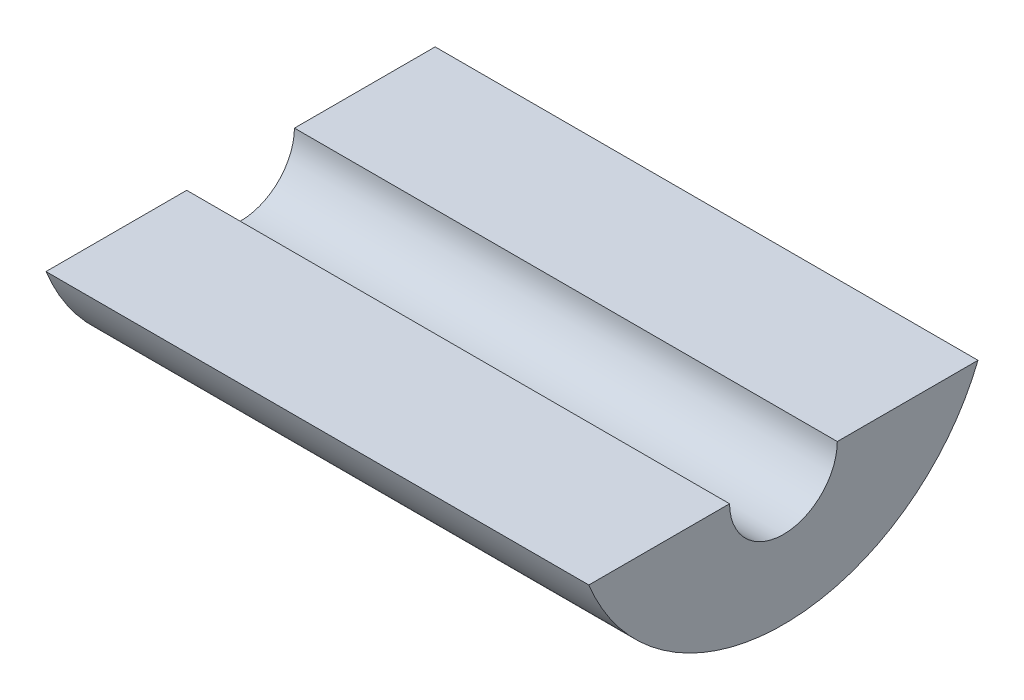
ISO-10303-21;
HEADER;
FILE_DESCRIPTION(('STEP AP214'),'2;1');
FILE_NAME('part.step','',(''),(''),'','','');
FILE_SCHEMA(('AUTOMOTIVE_DESIGN { 1 0 10303 214 1 1 1 1 }'));
ENDSEC;
DATA;
#1=APPLICATION_CONTEXT('core data for automotive mechanical design processes');
#2=APPLICATION_PROTOCOL_DEFINITION('international standard','automotive_design',2000,#1);
#3=PRODUCT_CONTEXT('',#1,'mechanical');
#4=PRODUCT('Part','Part','',(#3));
#5=PRODUCT_RELATED_PRODUCT_CATEGORY('part','',(#4));
#6=PRODUCT_DEFINITION_FORMATION('','',#4);
#7=PRODUCT_DEFINITION_CONTEXT('part definition',#1,'design');
#8=PRODUCT_DEFINITION('design','',#6,#7);
#9=PRODUCT_DEFINITION_SHAPE('','',#8);
#10=(LENGTH_UNIT() NAMED_UNIT(*) SI_UNIT(.MILLI.,.METRE.));
#11=(NAMED_UNIT(*) PLANE_ANGLE_UNIT() SI_UNIT($,.RADIAN.));
#12=(NAMED_UNIT(*) SI_UNIT($,.STERADIAN.) SOLID_ANGLE_UNIT());
#13=UNCERTAINTY_MEASURE_WITH_UNIT(LENGTH_MEASURE(1.E-05),#10,'distance_accuracy_value','');
#14=(GEOMETRIC_REPRESENTATION_CONTEXT(3) GLOBAL_UNCERTAINTY_ASSIGNED_CONTEXT((#13)) GLOBAL_UNIT_ASSIGNED_CONTEXT((#10,
#11,#12)) REPRESENTATION_CONTEXT('',''));
#15=CARTESIAN_POINT('',(0.,0.,0.));
#16=DIRECTION('',(0.,0.,1.));
#17=DIRECTION('',(1.,0.,0.));
#18=AXIS2_PLACEMENT_3D('',#15,#16,#17);
#19=CARTESIAN_POINT('',(0.,5.5,0.));
#20=DIRECTION('',(0.,1.,0.));
#21=DIRECTION('',(0.,0.,1.));
#22=AXIS2_PLACEMENT_3D('',#19,#20,#21);
#23=PLANE('',#22);
#24=DIRECTION('',(-1.,0.,0.));
#25=VECTOR('',#24,1.);
#26=CARTESIAN_POINT('',(80.01,5.5,6.51005000055557));
#27=LINE('',#26,#25);
#28=CARTESIAN_POINT('',(28.67,5.5,6.51005000055557));
#29=VERTEX_POINT('',#28);
#30=CARTESIAN_POINT('',(51.34,5.5,6.51005000055557));
#31=VERTEX_POINT('',#30);
#32=EDGE_CURVE('E94',#29,#31,#27,.F.);
#33=ORIENTED_EDGE('',*,*,#32,.T.);
#34=DIRECTION('',(0.,0.,-1.));
#35=VECTOR('',#34,1.);
#36=CARTESIAN_POINT('',(51.34,5.5,17.52));
#37=LINE('',#36,#35);
#38=CARTESIAN_POINT('',(51.34,5.5,0.634581549236986));
#39=VERTEX_POINT('',#38);
#40=EDGE_CURVE('E102',#31,#39,#37,.T.);
#41=ORIENTED_EDGE('',*,*,#40,.T.);
#42=DIRECTION('',(-1.,0.,0.));
#43=VECTOR('',#42,1.);
#44=CARTESIAN_POINT('',(80.01,5.5,0.634581549236986));
#45=LINE('',#44,#43);
#46=CARTESIAN_POINT('',(28.67,5.5,0.634581549236986));
#47=VERTEX_POINT('',#46);
#48=EDGE_CURVE('E98',#47,#39,#45,.F.);
#49=ORIENTED_EDGE('',*,*,#48,.F.);
#50=DIRECTION('',(0.,0.,1.));
#51=VECTOR('',#50,1.);
#52=CARTESIAN_POINT('',(28.67,5.5,17.52));
#53=LINE('',#52,#51);
#54=EDGE_CURVE('E87',#47,#29,#53,.T.);
#55=ORIENTED_EDGE('',*,*,#54,.T.);
#56=EDGE_LOOP('',(#33,#41,#49,#55));
#57=FACE_BOUND('',#56,.T.);
#58=ADVANCED_FACE('F42',(#57),#23,.T.);
#59=DIRECTION('',(-1.,0.,0.));
#60=VECTOR('',#59,1.);
#61=CARTESIAN_POINT('',(80.01,5.5,16.885418450763));
#62=LINE('',#61,#60);
#63=CARTESIAN_POINT('',(51.34,5.5,16.885418450763));
#64=VERTEX_POINT('',#63);
#65=CARTESIAN_POINT('',(28.67,5.5,16.885418450763));
#66=VERTEX_POINT('',#65);
#67=EDGE_CURVE('E46',#64,#66,#62,.T.);
#68=ORIENTED_EDGE('',*,*,#67,.F.);
#69=CARTESIAN_POINT('',(51.34,5.5,11.0099499994444));
#70=VERTEX_POINT('',#69);
#71=EDGE_CURVE('E104',#64,#70,#37,.T.);
#72=ORIENTED_EDGE('',*,*,#71,.T.);
#73=DIRECTION('',(-1.,0.,0.));
#74=VECTOR('',#73,1.);
#75=CARTESIAN_POINT('',(80.01,5.5,11.0099499994444));
#76=LINE('',#75,#74);
#77=CARTESIAN_POINT('',(28.67,5.5,11.0099499994444));
#78=VERTEX_POINT('',#77);
#79=EDGE_CURVE('E99',#70,#78,#76,.T.);
#80=ORIENTED_EDGE('',*,*,#79,.T.);
#81=EDGE_CURVE('E89',#78,#66,#53,.T.);
#82=ORIENTED_EDGE('',*,*,#81,.T.);
#83=EDGE_LOOP('',(#68,#72,#80,#82));
#84=FACE_BOUND('',#83,.T.);
#85=ADVANCED_FACE('F113',(#84),#23,.T.);
#86=CARTESIAN_POINT('',(80.01,8.76,8.76));
#87=DIRECTION('',(-1.,0.,0.));
#88=DIRECTION('',(0.,0.,1.));
#89=AXIS2_PLACEMENT_3D('',#86,#87,#88);
#90=CYLINDRICAL_SURFACE('',#89,8.755);
#91=CARTESIAN_POINT('',(28.67,8.76,8.76));
#92=DIRECTION('',(1.,0.,0.));
#93=DIRECTION('',(0.,0.,-1.));
#94=AXIS2_PLACEMENT_3D('',#91,#92,#93);
#95=CIRCLE('',#94,8.755);
#96=EDGE_CURVE('E107',#66,#47,#95,.T.);
#97=ORIENTED_EDGE('',*,*,#96,.T.);
#98=ORIENTED_EDGE('',*,*,#48,.T.);
#99=CARTESIAN_POINT('',(51.34,8.76,8.76));
#100=DIRECTION('',(-1.,0.,0.));
#101=DIRECTION('',(0.,0.,1.));
#102=AXIS2_PLACEMENT_3D('',#99,#100,#101);
#103=CIRCLE('',#102,8.755);
#104=EDGE_CURVE('E59',#39,#64,#103,.T.);
#105=ORIENTED_EDGE('',*,*,#104,.T.);
#106=ORIENTED_EDGE('',*,*,#67,.T.);
#107=EDGE_LOOP('',(#97,#98,#105,#106));
#108=FACE_BOUND('',#107,.T.);
#109=ADVANCED_FACE('F115',(#108),#90,.T.);
#110=CARTESIAN_POINT('',(80.01,5.515,8.76));
#111=DIRECTION('',(-1.,0.,0.));
#112=DIRECTION('',(0.,0.,1.));
#113=AXIS2_PLACEMENT_3D('',#110,#111,#112);
#114=CYLINDRICAL_SURFACE('',#113,2.25);
#115=ORIENTED_EDGE('',*,*,#32,.F.);
#116=CARTESIAN_POINT('',(28.67,5.515,8.76));
#117=DIRECTION('',(-1.,0.,0.));
#118=DIRECTION('',(0.,0.,1.));
#119=AXIS2_PLACEMENT_3D('',#116,#117,#118);
#120=CIRCLE('',#119,2.25);
#121=EDGE_CURVE('E11',#29,#78,#120,.T.);
#122=ORIENTED_EDGE('',*,*,#121,.T.);
#123=ORIENTED_EDGE('',*,*,#79,.F.);
#124=CARTESIAN_POINT('',(51.34,5.515,8.76));
#125=DIRECTION('',(-1.,0.,0.));
#126=DIRECTION('',(0.,0.,1.));
#127=AXIS2_PLACEMENT_3D('',#124,#125,#126);
#128=CIRCLE('',#127,2.25);
#129=EDGE_CURVE('E51',#31,#70,#128,.T.);
#130=ORIENTED_EDGE('',*,*,#129,.F.);
#131=EDGE_LOOP('',(#115,#122,#123,#130));
#132=FACE_BOUND('',#131,.T.);
#133=ADVANCED_FACE('F95',(#132),#114,.F.);
#134=CARTESIAN_POINT('',(51.34,0.,17.52));
#135=DIRECTION('',(-1.,0.,0.));
#136=DIRECTION('',(0.,0.,1.));
#137=AXIS2_PLACEMENT_3D('',#134,#135,#136);
#138=PLANE('',#137);
#139=ORIENTED_EDGE('',*,*,#71,.F.);
#140=ORIENTED_EDGE('',*,*,#104,.F.);
#141=ORIENTED_EDGE('',*,*,#40,.F.);
#142=ORIENTED_EDGE('',*,*,#129,.T.);
#143=EDGE_LOOP('',(#139,#140,#141,#142));
#144=FACE_BOUND('',#143,.T.);
#145=ADVANCED_FACE('F44',(#144),#138,.F.);
#146=CARTESIAN_POINT('',(28.67,12.77,17.52));
#147=DIRECTION('',(1.,0.,0.));
#148=DIRECTION('',(0.,0.,-1.));
#149=AXIS2_PLACEMENT_3D('',#146,#147,#148);
#150=PLANE('',#149);
#151=ORIENTED_EDGE('',*,*,#54,.F.);
#152=ORIENTED_EDGE('',*,*,#96,.F.);
#153=ORIENTED_EDGE('',*,*,#81,.F.);
#154=ORIENTED_EDGE('',*,*,#121,.F.);
#155=EDGE_LOOP('',(#151,#152,#153,#154));
#156=FACE_BOUND('',#155,.T.);
#157=ADVANCED_FACE('F85',(#156),#150,.F.);
#158=CLOSED_SHELL('',(#58,#85,#109,#133,#145,#157));
#159=MANIFOLD_SOLID_BREP('B2',#158);
#160=ADVANCED_BREP_SHAPE_REPRESENTATION('',(#18,#159),#14);
#161=SHAPE_DEFINITION_REPRESENTATION(#9,#160);
ENDSEC;
END-ISO-10303-21;
